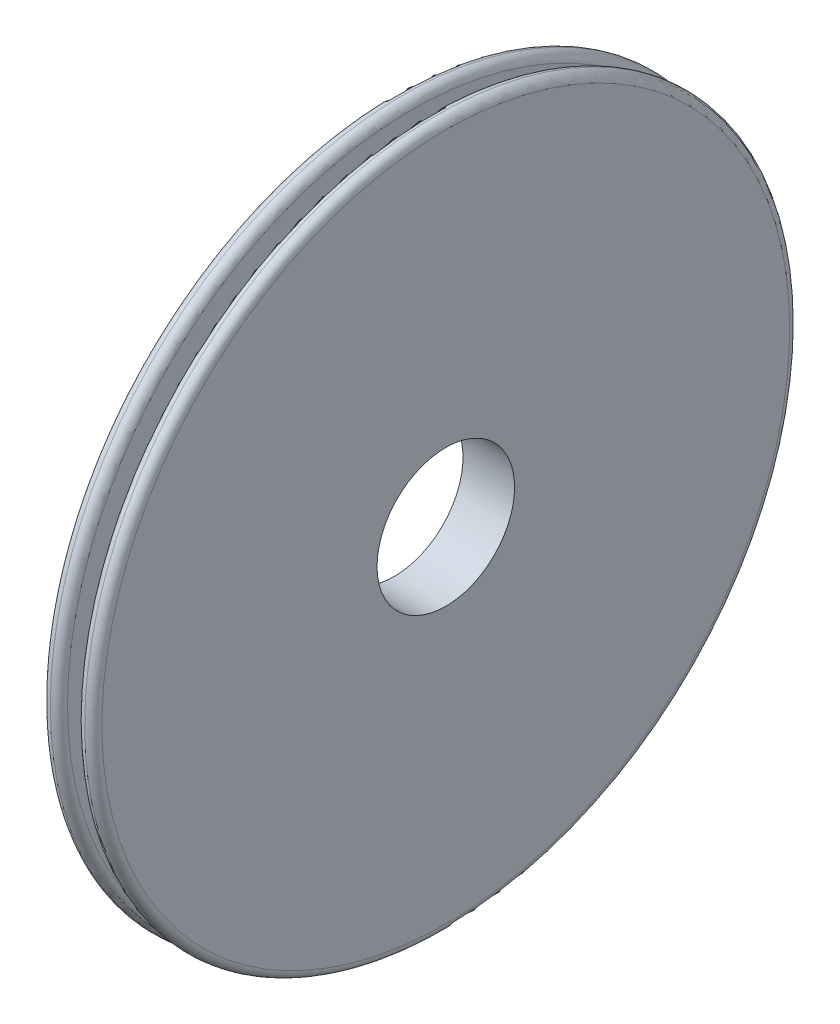
ISO-10303-21;
HEADER;
FILE_DESCRIPTION(('STEP AP214'),'2;1');
FILE_NAME('part.step','',(''),(''),'','','');
FILE_SCHEMA(('AUTOMOTIVE_DESIGN { 1 0 10303 214 1 1 1 1 }'));
ENDSEC;
DATA;
#1=APPLICATION_CONTEXT('core data for automotive mechanical design processes');
#2=APPLICATION_PROTOCOL_DEFINITION('international standard','automotive_design',2000,#1);
#3=PRODUCT_CONTEXT('',#1,'mechanical');
#4=PRODUCT('Part','Part','',(#3));
#5=PRODUCT_RELATED_PRODUCT_CATEGORY('part','',(#4));
#6=PRODUCT_DEFINITION_FORMATION('','',#4);
#7=PRODUCT_DEFINITION_CONTEXT('part definition',#1,'design');
#8=PRODUCT_DEFINITION('design','',#6,#7);
#9=PRODUCT_DEFINITION_SHAPE('','',#8);
#10=(LENGTH_UNIT() NAMED_UNIT(*) SI_UNIT(.MILLI.,.METRE.));
#11=(NAMED_UNIT(*) PLANE_ANGLE_UNIT() SI_UNIT($,.RADIAN.));
#12=(NAMED_UNIT(*) SI_UNIT($,.STERADIAN.) SOLID_ANGLE_UNIT());
#13=UNCERTAINTY_MEASURE_WITH_UNIT(LENGTH_MEASURE(1.E-05),#10,'distance_accuracy_value','');
#14=(GEOMETRIC_REPRESENTATION_CONTEXT(3) GLOBAL_UNCERTAINTY_ASSIGNED_CONTEXT((#13)) GLOBAL_UNIT_ASSIGNED_CONTEXT((#10,
#11,#12)) REPRESENTATION_CONTEXT('',''));
#15=CARTESIAN_POINT('',(0.,0.,0.));
#16=DIRECTION('',(0.,0.,1.));
#17=DIRECTION('',(1.,0.,0.));
#18=AXIS2_PLACEMENT_3D('',#15,#16,#17);
#19=CARTESIAN_POINT('',(-3.,41.,0.));
#20=DIRECTION('',(1.,0.,0.));
#21=DIRECTION('',(0.,0.,-1.));
#22=AXIS2_PLACEMENT_3D('',#19,#20,#21);
#23=PLANE('',#22);
#24=CARTESIAN_POINT('',(-3.,0.,0.));
#25=DIRECTION('',(1.,0.,0.));
#26=DIRECTION('',(0.,0.,-1.));
#27=AXIS2_PLACEMENT_3D('',#24,#25,#26);
#28=CIRCLE('',#27,40.);
#29=CARTESIAN_POINT('',(-3.,0.,-40.));
#30=VERTEX_POINT('',#29);
#31=EDGE_CURVE('E110',#30,#30,#28,.F.);
#32=ORIENTED_EDGE('',*,*,#31,.T.);
#33=EDGE_LOOP('',(#32));
#34=FACE_BOUND('',#33,.T.);
#35=CARTESIAN_POINT('',(-3.,0.,0.));
#36=DIRECTION('',(-1.,0.,0.));
#37=DIRECTION('',(0.,0.,1.));
#38=AXIS2_PLACEMENT_3D('',#35,#36,#37);
#39=CIRCLE('',#38,8.);
#40=CARTESIAN_POINT('',(-3.,0.,8.));
#41=VERTEX_POINT('',#40);
#42=EDGE_CURVE('E112',#41,#41,#39,.T.);
#43=ORIENTED_EDGE('',*,*,#42,.F.);
#44=EDGE_LOOP('',(#43));
#45=FACE_BOUND('',#44,.T.);
#46=ADVANCED_FACE('F36',(#34,#45),#23,.F.);
#47=CARTESIAN_POINT('',(0.,0.,0.));
#48=DIRECTION('',(-1.,0.,0.));
#49=DIRECTION('',(0.,0.,1.));
#50=AXIS2_PLACEMENT_3D('',#47,#48,#49);
#51=CYLINDRICAL_SURFACE('',#50,8.);
#52=CARTESIAN_POINT('',(3.,0.,0.));
#53=DIRECTION('',(-1.,0.,0.));
#54=DIRECTION('',(0.,0.,1.));
#55=AXIS2_PLACEMENT_3D('',#52,#53,#54);
#56=CIRCLE('',#55,8.);
#57=CARTESIAN_POINT('',(3.,0.,8.));
#58=VERTEX_POINT('',#57);
#59=EDGE_CURVE('E118',#58,#58,#56,.T.);
#60=ORIENTED_EDGE('',*,*,#59,.F.);
#61=EDGE_LOOP('',(#60));
#62=FACE_BOUND('',#61,.T.);
#63=ORIENTED_EDGE('',*,*,#42,.T.);
#64=EDGE_LOOP('',(#63));
#65=FACE_BOUND('',#64,.T.);
#66=ADVANCED_FACE('F81',(#62,#65),#51,.F.);
#67=CARTESIAN_POINT('',(3.,41.,0.));
#68=DIRECTION('',(1.,0.,0.));
#69=DIRECTION('',(0.,0.,-1.));
#70=AXIS2_PLACEMENT_3D('',#67,#68,#69);
#71=PLANE('',#70);
#72=CARTESIAN_POINT('',(3.,0.,0.));
#73=DIRECTION('',(1.,0.,0.));
#74=DIRECTION('',(0.,0.,-1.));
#75=AXIS2_PLACEMENT_3D('',#72,#73,#74);
#76=CIRCLE('',#75,40.);
#77=CARTESIAN_POINT('',(3.,0.,-40.));
#78=VERTEX_POINT('',#77);
#79=EDGE_CURVE('E45',#78,#78,#76,.T.);
#80=ORIENTED_EDGE('',*,*,#79,.T.);
#81=EDGE_LOOP('',(#80));
#82=FACE_BOUND('',#81,.T.);
#83=ORIENTED_EDGE('',*,*,#59,.T.);
#84=EDGE_LOOP('',(#83));
#85=FACE_BOUND('',#84,.T.);
#86=ADVANCED_FACE('F89',(#82,#85),#71,.T.);
#87=CARTESIAN_POINT('',(1.,36.,0.));
#88=DIRECTION('',(-1.,0.,0.));
#89=DIRECTION('',(0.,0.,1.));
#90=AXIS2_PLACEMENT_3D('',#87,#88,#89);
#91=PLANE('',#90);
#92=CARTESIAN_POINT('',(1.,0.,0.));
#93=DIRECTION('',(-1.,0.,0.));
#94=DIRECTION('',(0.,0.,1.));
#95=AXIS2_PLACEMENT_3D('',#92,#93,#94);
#96=CIRCLE('',#95,40.);
#97=CARTESIAN_POINT('',(1.,0.,40.));
#98=VERTEX_POINT('',#97);
#99=EDGE_CURVE('E10',#98,#98,#96,.T.);
#100=ORIENTED_EDGE('',*,*,#99,.T.);
#101=EDGE_LOOP('',(#100));
#102=FACE_BOUND('',#101,.T.);
#103=CARTESIAN_POINT('',(1.,0.,0.));
#104=DIRECTION('',(-1.,0.,0.));
#105=DIRECTION('',(0.,0.,1.));
#106=AXIS2_PLACEMENT_3D('',#103,#104,#105);
#107=CIRCLE('',#106,36.);
#108=CARTESIAN_POINT('',(1.,0.,36.));
#109=VERTEX_POINT('',#108);
#110=EDGE_CURVE('E63',#109,#109,#107,.T.);
#111=ORIENTED_EDGE('',*,*,#110,.F.);
#112=EDGE_LOOP('',(#111));
#113=FACE_BOUND('',#112,.T.);
#114=ADVANCED_FACE('F128',(#102,#113),#91,.T.);
#115=CARTESIAN_POINT('',(0.,0.,0.));
#116=DIRECTION('',(-1.,0.,0.));
#117=DIRECTION('',(0.,0.,1.));
#118=AXIS2_PLACEMENT_3D('',#115,#116,#117);
#119=CYLINDRICAL_SURFACE('',#118,36.);
#120=ORIENTED_EDGE('',*,*,#110,.T.);
#121=EDGE_LOOP('',(#120));
#122=FACE_BOUND('',#121,.T.);
#123=CARTESIAN_POINT('',(-1.,0.,0.));
#124=DIRECTION('',(-1.,0.,0.));
#125=DIRECTION('',(0.,0.,1.));
#126=AXIS2_PLACEMENT_3D('',#123,#124,#125);
#127=CIRCLE('',#126,36.);
#128=CARTESIAN_POINT('',(-1.,0.,36.));
#129=VERTEX_POINT('',#128);
#130=EDGE_CURVE('E57',#129,#129,#127,.T.);
#131=ORIENTED_EDGE('',*,*,#130,.F.);
#132=EDGE_LOOP('',(#131));
#133=FACE_BOUND('',#132,.T.);
#134=ADVANCED_FACE('F103',(#122,#133),#119,.T.);
#135=CARTESIAN_POINT('',(-1.,36.,0.));
#136=DIRECTION('',(-1.,0.,0.));
#137=DIRECTION('',(0.,0.,1.));
#138=AXIS2_PLACEMENT_3D('',#135,#136,#137);
#139=PLANE('',#138);
#140=CARTESIAN_POINT('',(-1.,0.,0.));
#141=DIRECTION('',(-1.,0.,0.));
#142=DIRECTION('',(0.,0.,1.));
#143=AXIS2_PLACEMENT_3D('',#140,#141,#142);
#144=CIRCLE('',#143,40.);
#145=CARTESIAN_POINT('',(-1.,0.,40.));
#146=VERTEX_POINT('',#145);
#147=EDGE_CURVE('E51',#146,#146,#144,.F.);
#148=ORIENTED_EDGE('',*,*,#147,.T.);
#149=EDGE_LOOP('',(#148));
#150=FACE_BOUND('',#149,.T.);
#151=ORIENTED_EDGE('',*,*,#130,.T.);
#152=EDGE_LOOP('',(#151));
#153=FACE_BOUND('',#152,.T.);
#154=ADVANCED_FACE('F97',(#150,#153),#139,.F.);
#155=CARTESIAN_POINT('',(-2.,0.,0.));
#156=DIRECTION('',(-1.,0.,0.));
#157=DIRECTION('',(0.,0.,1.));
#158=AXIS2_PLACEMENT_3D('',#155,#156,#157);
#159=TOROIDAL_SURFACE('',#158,40.,1.);
#160=ORIENTED_EDGE('',*,*,#147,.F.);
#161=EDGE_LOOP('',(#160));
#162=FACE_BOUND('',#161,.T.);
#163=CARTESIAN_POINT('',(-2.,0.,0.));
#164=DIRECTION('',(-1.,0.,0.));
#165=DIRECTION('',(0.,0.,1.));
#166=AXIS2_PLACEMENT_3D('',#163,#164,#165);
#167=CIRCLE('',#166,41.);
#168=CARTESIAN_POINT('',(-2.,0.,41.));
#169=VERTEX_POINT('',#168);
#170=EDGE_CURVE('E54',#169,#169,#167,.T.);
#171=ORIENTED_EDGE('',*,*,#170,.F.);
#172=EDGE_LOOP('',(#171));
#173=FACE_BOUND('',#172,.T.);
#174=ADVANCED_FACE('F78',(#162,#173),#159,.T.);
#175=CARTESIAN_POINT('',(-2.,0.,0.));
#176=DIRECTION('',(1.,0.,0.));
#177=DIRECTION('',(0.,0.,-1.));
#178=AXIS2_PLACEMENT_3D('',#175,#176,#177);
#179=TOROIDAL_SURFACE('',#178,40.,1.);
#180=ORIENTED_EDGE('',*,*,#170,.T.);
#181=EDGE_LOOP('',(#180));
#182=FACE_BOUND('',#181,.T.);
#183=ORIENTED_EDGE('',*,*,#31,.F.);
#184=EDGE_LOOP('',(#183));
#185=FACE_BOUND('',#184,.T.);
#186=ADVANCED_FACE('F71',(#182,#185),#179,.T.);
#187=CARTESIAN_POINT('',(2.,0.,0.));
#188=DIRECTION('',(-1.,0.,0.));
#189=DIRECTION('',(0.,0.,1.));
#190=AXIS2_PLACEMENT_3D('',#187,#188,#189);
#191=TOROIDAL_SURFACE('',#190,40.,1.);
#192=ORIENTED_EDGE('',*,*,#99,.F.);
#193=EDGE_LOOP('',(#192));
#194=FACE_BOUND('',#193,.T.);
#195=CARTESIAN_POINT('',(2.,0.,0.));
#196=DIRECTION('',(-1.,0.,0.));
#197=DIRECTION('',(0.,0.,1.));
#198=AXIS2_PLACEMENT_3D('',#195,#196,#197);
#199=CIRCLE('',#198,41.);
#200=CARTESIAN_POINT('',(2.,0.,41.));
#201=VERTEX_POINT('',#200);
#202=EDGE_CURVE('E40',#201,#201,#199,.F.);
#203=ORIENTED_EDGE('',*,*,#202,.F.);
#204=EDGE_LOOP('',(#203));
#205=FACE_BOUND('',#204,.T.);
#206=ADVANCED_FACE('F38',(#194,#205),#191,.T.);
#207=CARTESIAN_POINT('',(2.,0.,0.));
#208=DIRECTION('',(1.,0.,0.));
#209=DIRECTION('',(0.,0.,-1.));
#210=AXIS2_PLACEMENT_3D('',#207,#208,#209);
#211=TOROIDAL_SURFACE('',#210,40.,1.);
#212=ORIENTED_EDGE('',*,*,#79,.F.);
#213=EDGE_LOOP('',(#212));
#214=FACE_BOUND('',#213,.T.);
#215=ORIENTED_EDGE('',*,*,#202,.T.);
#216=EDGE_LOOP('',(#215));
#217=FACE_BOUND('',#216,.T.);
#218=ADVANCED_FACE('F68',(#214,#217),#211,.T.);
#219=CLOSED_SHELL('',(#46,#66,#86,#114,#134,#154,#174,#186,#206,#218));
#220=MANIFOLD_SOLID_BREP('B2',#219);
#221=ADVANCED_BREP_SHAPE_REPRESENTATION('',(#18,#220),#14);
#222=SHAPE_DEFINITION_REPRESENTATION(#9,#221);
ENDSEC;
END-ISO-10303-21;
